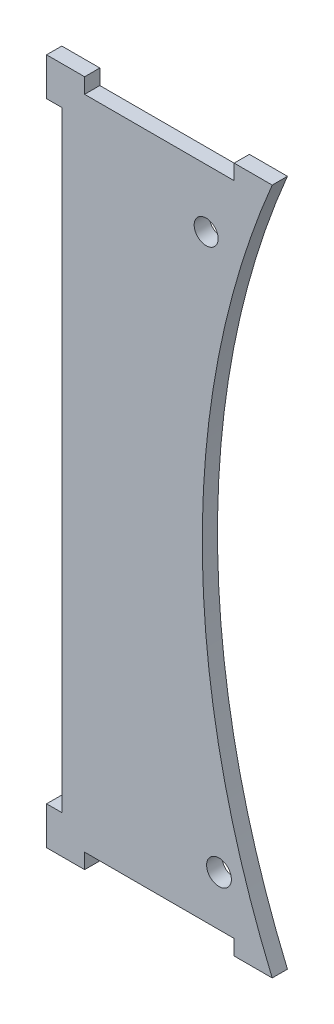
ISO-10303-21;
HEADER;
FILE_DESCRIPTION(('STEP AP214'),'2;1');
FILE_NAME('part.step','',(''),(''),'','','');
FILE_SCHEMA(('AUTOMOTIVE_DESIGN { 1 0 10303 214 1 1 1 1 }'));
ENDSEC;
DATA;
#1=APPLICATION_CONTEXT('core data for automotive mechanical design processes');
#2=APPLICATION_PROTOCOL_DEFINITION('international standard','automotive_design',2000,#1);
#3=PRODUCT_CONTEXT('',#1,'mechanical');
#4=PRODUCT('Part','Part','',(#3));
#5=PRODUCT_RELATED_PRODUCT_CATEGORY('part','',(#4));
#6=PRODUCT_DEFINITION_FORMATION('','',#4);
#7=PRODUCT_DEFINITION_CONTEXT('part definition',#1,'design');
#8=PRODUCT_DEFINITION('design','',#6,#7);
#9=PRODUCT_DEFINITION_SHAPE('','',#8);
#10=(LENGTH_UNIT() NAMED_UNIT(*) SI_UNIT(.MILLI.,.METRE.));
#11=(NAMED_UNIT(*) PLANE_ANGLE_UNIT() SI_UNIT($,.RADIAN.));
#12=(NAMED_UNIT(*) SI_UNIT($,.STERADIAN.) SOLID_ANGLE_UNIT());
#13=UNCERTAINTY_MEASURE_WITH_UNIT(LENGTH_MEASURE(1.E-05),#10,'distance_accuracy_value','');
#14=(GEOMETRIC_REPRESENTATION_CONTEXT(3) GLOBAL_UNCERTAINTY_ASSIGNED_CONTEXT((#13)) GLOBAL_UNIT_ASSIGNED_CONTEXT((#10,
#11,#12)) REPRESENTATION_CONTEXT('',''));
#15=CARTESIAN_POINT('',(0.,0.,0.));
#16=DIRECTION('',(0.,0.,1.));
#17=DIRECTION('',(1.,0.,0.));
#18=AXIS2_PLACEMENT_3D('',#15,#16,#17);
#19=CARTESIAN_POINT('',(338.870481156332,-148.49363352269,5.08));
#20=DIRECTION('',(0.,0.,-1.));
#21=DIRECTION('',(-1.,0.,0.));
#22=AXIS2_PLACEMENT_3D('',#19,#20,#21);
#23=CYLINDRICAL_SURFACE('',#22,293.026669626808);
#24=CARTESIAN_POINT('',(338.870481156332,-148.49363352269,0.));
#25=DIRECTION('',(0.,0.,1.));
#26=DIRECTION('',(1.,0.,0.));
#27=AXIS2_PLACEMENT_3D('',#24,#25,#26);
#28=CIRCLE('',#27,293.026669626808);
#29=CARTESIAN_POINT('',(69.1901437708773,-33.8762494125753,0.));
#30=VERTEX_POINT('',#29);
#31=CARTESIAN_POINT('',(69.1901437708773,-263.111017632805,0.));
#32=VERTEX_POINT('',#31);
#33=EDGE_CURVE('E184',#30,#32,#28,.T.);
#34=ORIENTED_EDGE('',*,*,#33,.F.);
#35=DIRECTION('',(0.,0.,-1.));
#36=VECTOR('',#35,1.);
#37=CARTESIAN_POINT('',(69.1901437708773,-33.8762494125753,5.08));
#38=LINE('',#37,#36);
#39=CARTESIAN_POINT('',(69.1901437708773,-33.8762494125753,5.08));
#40=VERTEX_POINT('',#39);
#41=EDGE_CURVE('E11',#40,#30,#38,.T.);
#42=ORIENTED_EDGE('',*,*,#41,.F.);
#43=CARTESIAN_POINT('',(338.870481156332,-148.49363352269,5.08));
#44=DIRECTION('',(0.,0.,1.));
#45=DIRECTION('',(1.,0.,0.));
#46=AXIS2_PLACEMENT_3D('',#43,#44,#45);
#47=CIRCLE('',#46,293.026669626808);
#48=CARTESIAN_POINT('',(69.1901437708773,-263.111017632805,5.08));
#49=VERTEX_POINT('',#48);
#50=EDGE_CURVE('E229',#40,#49,#47,.T.);
#51=ORIENTED_EDGE('',*,*,#50,.T.);
#52=DIRECTION('',(0.,0.,-1.));
#53=VECTOR('',#52,1.);
#54=CARTESIAN_POINT('',(69.1901437708773,-263.111017632805,5.08));
#55=LINE('',#54,#53);
#56=EDGE_CURVE('E51',#49,#32,#55,.T.);
#57=ORIENTED_EDGE('',*,*,#56,.T.);
#58=EDGE_LOOP('',(#34,#42,#51,#57));
#59=FACE_BOUND('',#58,.T.);
#60=ADVANCED_FACE('F35',(#59),#23,.F.);
#61=CARTESIAN_POINT('',(0.,-33.8762494125752,5.08));
#62=DIRECTION('',(0.,-1.,0.));
#63=DIRECTION('',(1.,0.,0.));
#64=AXIS2_PLACEMENT_3D('',#61,#62,#63);
#65=PLANE('',#64);
#66=DIRECTION('',(-1.,0.,0.));
#67=VECTOR('',#66,1.);
#68=CARTESIAN_POINT('',(0.,-33.8762494125752,0.));
#69=LINE('',#68,#67);
#70=CARTESIAN_POINT('',(56.4901437708773,-33.8762494125753,0.));
#71=VERTEX_POINT('',#70);
#72=EDGE_CURVE('E186',#30,#71,#69,.T.);
#73=ORIENTED_EDGE('',*,*,#72,.T.);
#74=DIRECTION('',(0.,0.,-1.));
#75=VECTOR('',#74,1.);
#76=CARTESIAN_POINT('',(56.4901437708773,-33.8762494125753,5.08));
#77=LINE('',#76,#75);
#78=CARTESIAN_POINT('',(56.4901437708773,-33.8762494125753,5.08));
#79=VERTEX_POINT('',#78);
#80=EDGE_CURVE('E43',#79,#71,#77,.T.);
#81=ORIENTED_EDGE('',*,*,#80,.F.);
#82=DIRECTION('',(-1.,0.,0.));
#83=VECTOR('',#82,1.);
#84=CARTESIAN_POINT('',(0.,-33.8762494125752,5.08));
#85=LINE('',#84,#83);
#86=EDGE_CURVE('E283',#40,#79,#85,.T.);
#87=ORIENTED_EDGE('',*,*,#86,.F.);
#88=ORIENTED_EDGE('',*,*,#41,.T.);
#89=EDGE_LOOP('',(#73,#81,#87,#88));
#90=FACE_BOUND('',#89,.T.);
#91=ADVANCED_FACE('F323',(#90),#65,.F.);
#92=CARTESIAN_POINT('',(56.4901437708773,0.,5.08));
#93=DIRECTION('',(1.,0.,0.));
#94=DIRECTION('',(0.,0.,-1.));
#95=AXIS2_PLACEMENT_3D('',#92,#93,#94);
#96=PLANE('',#95);
#97=DIRECTION('',(0.,-1.,0.));
#98=VECTOR('',#97,1.);
#99=CARTESIAN_POINT('',(56.4901437708773,0.,0.));
#100=LINE('',#99,#98);
#101=CARTESIAN_POINT('',(56.4901437708773,-38.9562494125753,0.));
#102=VERTEX_POINT('',#101);
#103=EDGE_CURVE('E188',#71,#102,#100,.T.);
#104=ORIENTED_EDGE('',*,*,#103,.T.);
#105=DIRECTION('',(0.,0.,-1.));
#106=VECTOR('',#105,1.);
#107=CARTESIAN_POINT('',(56.4901437708773,-38.9562494125753,5.08));
#108=LINE('',#107,#106);
#109=CARTESIAN_POINT('',(56.4901437708773,-38.9562494125753,5.08));
#110=VERTEX_POINT('',#109);
#111=EDGE_CURVE('E254',#110,#102,#108,.T.);
#112=ORIENTED_EDGE('',*,*,#111,.F.);
#113=DIRECTION('',(0.,-1.,0.));
#114=VECTOR('',#113,1.);
#115=CARTESIAN_POINT('',(56.4901437708773,0.,5.08));
#116=LINE('',#115,#114);
#117=EDGE_CURVE('E263',#79,#110,#116,.T.);
#118=ORIENTED_EDGE('',*,*,#117,.F.);
#119=ORIENTED_EDGE('',*,*,#80,.T.);
#120=EDGE_LOOP('',(#104,#112,#118,#119));
#121=FACE_BOUND('',#120,.T.);
#122=ADVANCED_FACE('F261',(#121),#96,.F.);
#123=CARTESIAN_POINT('',(0.,-38.9562494125753,5.08));
#124=DIRECTION('',(0.,-1.,0.));
#125=DIRECTION('',(0.,0.,-1.));
#126=AXIS2_PLACEMENT_3D('',#123,#124,#125);
#127=PLANE('',#126);
#128=DIRECTION('',(-1.,0.,0.));
#129=VECTOR('',#128,1.);
#130=CARTESIAN_POINT('',(0.,-38.9562494125753,0.));
#131=LINE('',#130,#129);
#132=CARTESIAN_POINT('',(6.56624495932001,-38.9562494125753,0.));
#133=VERTEX_POINT('',#132);
#134=EDGE_CURVE('E190',#102,#133,#131,.T.);
#135=ORIENTED_EDGE('',*,*,#134,.T.);
#136=DIRECTION('',(0.,0.,-1.));
#137=VECTOR('',#136,1.);
#138=CARTESIAN_POINT('',(6.56624495932001,-38.9562494125753,5.08));
#139=LINE('',#138,#137);
#140=CARTESIAN_POINT('',(6.56624495932001,-38.9562494125753,5.08));
#141=VERTEX_POINT('',#140);
#142=EDGE_CURVE('E252',#141,#133,#139,.T.);
#143=ORIENTED_EDGE('',*,*,#142,.F.);
#144=DIRECTION('',(-1.,0.,0.));
#145=VECTOR('',#144,1.);
#146=CARTESIAN_POINT('',(0.,-38.9562494125753,5.08));
#147=LINE('',#146,#145);
#148=EDGE_CURVE('E277',#110,#141,#147,.T.);
#149=ORIENTED_EDGE('',*,*,#148,.F.);
#150=ORIENTED_EDGE('',*,*,#111,.T.);
#151=EDGE_LOOP('',(#135,#143,#149,#150));
#152=FACE_BOUND('',#151,.T.);
#153=ADVANCED_FACE('F274',(#152),#127,.F.);
#154=CARTESIAN_POINT('',(6.56624495932001,0.,5.08));
#155=DIRECTION('',(1.,0.,0.));
#156=DIRECTION('',(0.,0.,-1.));
#157=AXIS2_PLACEMENT_3D('',#154,#155,#156);
#158=PLANE('',#157);
#159=DIRECTION('',(0.,-1.,0.));
#160=VECTOR('',#159,1.);
#161=CARTESIAN_POINT('',(6.56624495932001,0.,0.));
#162=LINE('',#161,#160);
#163=CARTESIAN_POINT('',(6.56624495932001,-33.8762494125753,0.));
#164=VERTEX_POINT('',#163);
#165=EDGE_CURVE('E193',#164,#133,#162,.T.);
#166=ORIENTED_EDGE('',*,*,#165,.F.);
#167=DIRECTION('',(0.,0.,-1.));
#168=VECTOR('',#167,1.);
#169=CARTESIAN_POINT('',(6.56624495932001,-33.8762494125753,5.08));
#170=LINE('',#169,#168);
#171=CARTESIAN_POINT('',(6.56624495932001,-33.8762494125753,5.08));
#172=VERTEX_POINT('',#171);
#173=EDGE_CURVE('E250',#172,#164,#170,.T.);
#174=ORIENTED_EDGE('',*,*,#173,.F.);
#175=DIRECTION('',(0.,-1.,0.));
#176=VECTOR('',#175,1.);
#177=CARTESIAN_POINT('',(6.56624495932001,0.,5.08));
#178=LINE('',#177,#176);
#179=EDGE_CURVE('E279',#172,#141,#178,.T.);
#180=ORIENTED_EDGE('',*,*,#179,.T.);
#181=ORIENTED_EDGE('',*,*,#142,.T.);
#182=EDGE_LOOP('',(#166,#174,#180,#181));
#183=FACE_BOUND('',#182,.T.);
#184=ADVANCED_FACE('F445',(#183),#158,.T.);
#185=CARTESIAN_POINT('',(0.,-33.8762494125753,5.08));
#186=DIRECTION('',(0.,-1.,0.));
#187=DIRECTION('',(1.,0.,0.));
#188=AXIS2_PLACEMENT_3D('',#185,#186,#187);
#189=PLANE('',#188);
#190=DIRECTION('',(-1.,0.,0.));
#191=VECTOR('',#190,1.);
#192=CARTESIAN_POINT('',(0.,-33.8762494125753,0.));
#193=LINE('',#192,#191);
#194=CARTESIAN_POINT('',(-6.13375504068001,-33.8762494125753,0.));
#195=VERTEX_POINT('',#194);
#196=EDGE_CURVE('E196',#164,#195,#193,.T.);
#197=ORIENTED_EDGE('',*,*,#196,.T.);
#198=DIRECTION('',(0.,0.,-1.));
#199=VECTOR('',#198,1.);
#200=CARTESIAN_POINT('',(-6.13375504068001,-33.8762494125753,5.08));
#201=LINE('',#200,#199);
#202=CARTESIAN_POINT('',(-6.13375504068001,-33.8762494125753,5.08));
#203=VERTEX_POINT('',#202);
#204=EDGE_CURVE('E247',#203,#195,#201,.T.);
#205=ORIENTED_EDGE('',*,*,#204,.F.);
#206=DIRECTION('',(-1.,0.,0.));
#207=VECTOR('',#206,1.);
#208=CARTESIAN_POINT('',(0.,-33.8762494125753,5.08));
#209=LINE('',#208,#207);
#210=EDGE_CURVE('E281',#172,#203,#209,.T.);
#211=ORIENTED_EDGE('',*,*,#210,.F.);
#212=ORIENTED_EDGE('',*,*,#173,.T.);
#213=EDGE_LOOP('',(#197,#205,#211,#212));
#214=FACE_BOUND('',#213,.T.);
#215=ADVANCED_FACE('F436',(#214),#189,.F.);
#216=CARTESIAN_POINT('',(-6.13375504067994,0.,5.08));
#217=DIRECTION('',(1.,0.,0.));
#218=DIRECTION('',(0.,1.,0.));
#219=AXIS2_PLACEMENT_3D('',#216,#217,#218);
#220=PLANE('',#219);
#221=DIRECTION('',(0.,-1.,0.));
#222=VECTOR('',#221,1.);
#223=CARTESIAN_POINT('',(-6.13375504067994,0.,0.));
#224=LINE('',#223,#222);
#225=CARTESIAN_POINT('',(-6.13375504068003,-46.5762494125753,0.));
#226=VERTEX_POINT('',#225);
#227=EDGE_CURVE('E198',#195,#226,#224,.T.);
#228=ORIENTED_EDGE('',*,*,#227,.T.);
#229=DIRECTION('',(0.,0.,-1.));
#230=VECTOR('',#229,1.);
#231=CARTESIAN_POINT('',(-6.13375504068003,-46.5762494125753,5.08));
#232=LINE('',#231,#230);
#233=CARTESIAN_POINT('',(-6.13375504068003,-46.5762494125753,5.08));
#234=VERTEX_POINT('',#233);
#235=EDGE_CURVE('E244',#234,#226,#232,.T.);
#236=ORIENTED_EDGE('',*,*,#235,.F.);
#237=DIRECTION('',(0.,-1.,0.));
#238=VECTOR('',#237,1.);
#239=CARTESIAN_POINT('',(-6.13375504067994,0.,5.08));
#240=LINE('',#239,#238);
#241=EDGE_CURVE('E288',#203,#234,#240,.T.);
#242=ORIENTED_EDGE('',*,*,#241,.F.);
#243=ORIENTED_EDGE('',*,*,#204,.T.);
#244=EDGE_LOOP('',(#228,#236,#242,#243));
#245=FACE_BOUND('',#244,.T.);
#246=ADVANCED_FACE('F427',(#245),#220,.F.);
#247=CARTESIAN_POINT('',(0.,-46.5762494125753,5.08));
#248=DIRECTION('',(0.,1.,0.));
#249=DIRECTION('',(0.,0.,1.));
#250=AXIS2_PLACEMENT_3D('',#247,#248,#249);
#251=PLANE('',#250);
#252=DIRECTION('',(1.,0.,0.));
#253=VECTOR('',#252,1.);
#254=CARTESIAN_POINT('',(0.,-46.5762494125753,0.));
#255=LINE('',#254,#253);
#256=CARTESIAN_POINT('',(-1.05375504068003,-46.5762494125753,0.));
#257=VERTEX_POINT('',#256);
#258=EDGE_CURVE('E200',#226,#257,#255,.T.);
#259=ORIENTED_EDGE('',*,*,#258,.T.);
#260=DIRECTION('',(0.,0.,-1.));
#261=VECTOR('',#260,1.);
#262=CARTESIAN_POINT('',(-1.05375504068003,-46.5762494125753,5.08));
#263=LINE('',#262,#261);
#264=CARTESIAN_POINT('',(-1.05375504068003,-46.5762494125753,5.08));
#265=VERTEX_POINT('',#264);
#266=EDGE_CURVE('E241',#265,#257,#263,.T.);
#267=ORIENTED_EDGE('',*,*,#266,.F.);
#268=DIRECTION('',(1.,0.,0.));
#269=VECTOR('',#268,1.);
#270=CARTESIAN_POINT('',(0.,-46.5762494125753,5.08));
#271=LINE('',#270,#269);
#272=EDGE_CURVE('E290',#234,#265,#271,.T.);
#273=ORIENTED_EDGE('',*,*,#272,.F.);
#274=ORIENTED_EDGE('',*,*,#235,.T.);
#275=EDGE_LOOP('',(#259,#267,#273,#274));
#276=FACE_BOUND('',#275,.T.);
#277=ADVANCED_FACE('F418',(#276),#251,.F.);
#278=CARTESIAN_POINT('',(-1.05375504068003,0.,5.08));
#279=DIRECTION('',(1.,0.,0.));
#280=DIRECTION('',(0.,0.,-1.));
#281=AXIS2_PLACEMENT_3D('',#278,#279,#280);
#282=PLANE('',#281);
#283=DIRECTION('',(0.,-1.,0.));
#284=VECTOR('',#283,1.);
#285=CARTESIAN_POINT('',(-1.05375504068003,0.,0.));
#286=LINE('',#285,#284);
#287=CARTESIAN_POINT('',(-1.05375504068003,-250.411017632805,0.));
#288=VERTEX_POINT('',#287);
#289=EDGE_CURVE('E202',#257,#288,#286,.T.);
#290=ORIENTED_EDGE('',*,*,#289,.T.);
#291=DIRECTION('',(0.,0.,-1.));
#292=VECTOR('',#291,1.);
#293=CARTESIAN_POINT('',(-1.05375504068003,-250.411017632805,5.08));
#294=LINE('',#293,#292);
#295=CARTESIAN_POINT('',(-1.05375504068003,-250.411017632805,5.08));
#296=VERTEX_POINT('',#295);
#297=EDGE_CURVE('E239',#296,#288,#294,.T.);
#298=ORIENTED_EDGE('',*,*,#297,.F.);
#299=DIRECTION('',(0.,-1.,0.));
#300=VECTOR('',#299,1.);
#301=CARTESIAN_POINT('',(-1.05375504068003,0.,5.08));
#302=LINE('',#301,#300);
#303=EDGE_CURVE('E292',#265,#296,#302,.T.);
#304=ORIENTED_EDGE('',*,*,#303,.F.);
#305=ORIENTED_EDGE('',*,*,#266,.T.);
#306=EDGE_LOOP('',(#290,#298,#304,#305));
#307=FACE_BOUND('',#306,.T.);
#308=ADVANCED_FACE('F409',(#307),#282,.F.);
#309=CARTESIAN_POINT('',(0.,-250.411017632805,5.08));
#310=DIRECTION('',(0.,1.,0.));
#311=DIRECTION('',(0.,0.,1.));
#312=AXIS2_PLACEMENT_3D('',#309,#310,#311);
#313=PLANE('',#312);
#314=DIRECTION('',(1.,0.,0.));
#315=VECTOR('',#314,1.);
#316=CARTESIAN_POINT('',(0.,-250.411017632805,0.));
#317=LINE('',#316,#315);
#318=CARTESIAN_POINT('',(-6.13375504068003,-250.411017632805,0.));
#319=VERTEX_POINT('',#318);
#320=EDGE_CURVE('E205',#319,#288,#317,.T.);
#321=ORIENTED_EDGE('',*,*,#320,.F.);
#322=DIRECTION('',(0.,0.,-1.));
#323=VECTOR('',#322,1.);
#324=CARTESIAN_POINT('',(-6.13375504068003,-250.411017632805,5.08));
#325=LINE('',#324,#323);
#326=CARTESIAN_POINT('',(-6.13375504068003,-250.411017632805,5.08));
#327=VERTEX_POINT('',#326);
#328=EDGE_CURVE('E237',#327,#319,#325,.T.);
#329=ORIENTED_EDGE('',*,*,#328,.F.);
#330=DIRECTION('',(1.,0.,0.));
#331=VECTOR('',#330,1.);
#332=CARTESIAN_POINT('',(0.,-250.411017632805,5.08));
#333=LINE('',#332,#331);
#334=EDGE_CURVE('E294',#327,#296,#333,.T.);
#335=ORIENTED_EDGE('',*,*,#334,.T.);
#336=ORIENTED_EDGE('',*,*,#297,.T.);
#337=EDGE_LOOP('',(#321,#329,#335,#336));
#338=FACE_BOUND('',#337,.T.);
#339=ADVANCED_FACE('F401',(#338),#313,.T.);
#340=CARTESIAN_POINT('',(-6.13375504068098,0.,5.08));
#341=DIRECTION('',(1.,0.,0.));
#342=DIRECTION('',(0.,1.,0.));
#343=AXIS2_PLACEMENT_3D('',#340,#341,#342);
#344=PLANE('',#343);
#345=DIRECTION('',(0.,-1.,0.));
#346=VECTOR('',#345,1.);
#347=CARTESIAN_POINT('',(-6.13375504068098,0.,0.));
#348=LINE('',#347,#346);
#349=CARTESIAN_POINT('',(-6.13375504067998,-263.111017632805,0.));
#350=VERTEX_POINT('',#349);
#351=EDGE_CURVE('E208',#319,#350,#348,.T.);
#352=ORIENTED_EDGE('',*,*,#351,.T.);
#353=DIRECTION('',(0.,0.,-1.));
#354=VECTOR('',#353,1.);
#355=CARTESIAN_POINT('',(-6.13375504067998,-263.111017632805,5.08));
#356=LINE('',#355,#354);
#357=CARTESIAN_POINT('',(-6.13375504067998,-263.111017632805,5.08));
#358=VERTEX_POINT('',#357);
#359=EDGE_CURVE('E235',#358,#350,#356,.T.);
#360=ORIENTED_EDGE('',*,*,#359,.F.);
#361=DIRECTION('',(0.,-1.,0.));
#362=VECTOR('',#361,1.);
#363=CARTESIAN_POINT('',(-6.13375504068098,0.,5.08));
#364=LINE('',#363,#362);
#365=EDGE_CURVE('E297',#327,#358,#364,.T.);
#366=ORIENTED_EDGE('',*,*,#365,.F.);
#367=ORIENTED_EDGE('',*,*,#328,.T.);
#368=EDGE_LOOP('',(#352,#360,#366,#367));
#369=FACE_BOUND('',#368,.T.);
#370=ADVANCED_FACE('F308',(#369),#344,.F.);
#371=CARTESIAN_POINT('',(-1.15004688900983E-12,-263.111017632805,5.08));
#372=DIRECTION('',(0.,-1.,0.));
#373=DIRECTION('',(1.,0.,0.));
#374=AXIS2_PLACEMENT_3D('',#371,#372,#373);
#375=PLANE('',#374);
#376=DIRECTION('',(-1.,0.,0.));
#377=VECTOR('',#376,1.);
#378=CARTESIAN_POINT('',(-1.15004688900983E-12,-263.111017632805,0.));
#379=LINE('',#378,#377);
#380=CARTESIAN_POINT('',(6.56624495932001,-263.111017632805,0.));
#381=VERTEX_POINT('',#380);
#382=EDGE_CURVE('E211',#381,#350,#379,.T.);
#383=ORIENTED_EDGE('',*,*,#382,.F.);
#384=DIRECTION('',(0.,0.,-1.));
#385=VECTOR('',#384,1.);
#386=CARTESIAN_POINT('',(6.56624495932001,-263.111017632805,5.08));
#387=LINE('',#386,#385);
#388=CARTESIAN_POINT('',(6.56624495932001,-263.111017632805,5.08));
#389=VERTEX_POINT('',#388);
#390=EDGE_CURVE('E233',#389,#381,#387,.T.);
#391=ORIENTED_EDGE('',*,*,#390,.F.);
#392=DIRECTION('',(-1.,0.,0.));
#393=VECTOR('',#392,1.);
#394=CARTESIAN_POINT('',(-1.15004688900983E-12,-263.111017632805,5.08));
#395=LINE('',#394,#393);
#396=EDGE_CURVE('E299',#389,#358,#395,.T.);
#397=ORIENTED_EDGE('',*,*,#396,.T.);
#398=ORIENTED_EDGE('',*,*,#359,.T.);
#399=EDGE_LOOP('',(#383,#391,#397,#398));
#400=FACE_BOUND('',#399,.T.);
#401=ADVANCED_FACE('F303',(#400),#375,.T.);
#402=CARTESIAN_POINT('',(6.56624495932001,0.,5.08));
#403=DIRECTION('',(-1.,0.,0.));
#404=DIRECTION('',(0.,0.,1.));
#405=AXIS2_PLACEMENT_3D('',#402,#403,#404);
#406=PLANE('',#405);
#407=DIRECTION('',(0.,1.,0.));
#408=VECTOR('',#407,1.);
#409=CARTESIAN_POINT('',(6.56624495932001,0.,0.));
#410=LINE('',#409,#408);
#411=CARTESIAN_POINT('',(6.56624495932001,-258.031017632805,0.));
#412=VERTEX_POINT('',#411);
#413=EDGE_CURVE('E214',#381,#412,#410,.T.);
#414=ORIENTED_EDGE('',*,*,#413,.T.);
#415=DIRECTION('',(0.,0.,-1.));
#416=VECTOR('',#415,1.);
#417=CARTESIAN_POINT('',(6.56624495932001,-258.031017632805,5.08));
#418=LINE('',#417,#416);
#419=CARTESIAN_POINT('',(6.56624495932001,-258.031017632805,5.08));
#420=VERTEX_POINT('',#419);
#421=EDGE_CURVE('E158',#420,#412,#418,.T.);
#422=ORIENTED_EDGE('',*,*,#421,.F.);
#423=DIRECTION('',(0.,1.,0.));
#424=VECTOR('',#423,1.);
#425=CARTESIAN_POINT('',(6.56624495932001,0.,5.08));
#426=LINE('',#425,#424);
#427=EDGE_CURVE('E169',#389,#420,#426,.T.);
#428=ORIENTED_EDGE('',*,*,#427,.F.);
#429=ORIENTED_EDGE('',*,*,#390,.T.);
#430=EDGE_LOOP('',(#414,#422,#428,#429));
#431=FACE_BOUND('',#430,.T.);
#432=ADVANCED_FACE('F313',(#431),#406,.F.);
#433=CARTESIAN_POINT('',(0.,-258.031017632805,5.08));
#434=DIRECTION('',(0.,-1.,0.));
#435=DIRECTION('',(0.,0.,-1.));
#436=AXIS2_PLACEMENT_3D('',#433,#434,#435);
#437=PLANE('',#436);
#438=DIRECTION('',(-1.,0.,0.));
#439=VECTOR('',#438,1.);
#440=CARTESIAN_POINT('',(0.,-258.031017632805,0.));
#441=LINE('',#440,#439);
#442=CARTESIAN_POINT('',(56.4901437708772,-258.031017632805,0.));
#443=VERTEX_POINT('',#442);
#444=EDGE_CURVE('E154',#443,#412,#441,.T.);
#445=ORIENTED_EDGE('',*,*,#444,.F.);
#446=DIRECTION('',(0.,0.,-1.));
#447=VECTOR('',#446,1.);
#448=CARTESIAN_POINT('',(56.4901437708772,-258.031017632805,5.08));
#449=LINE('',#448,#447);
#450=CARTESIAN_POINT('',(56.4901437708772,-258.031017632805,5.08));
#451=VERTEX_POINT('',#450);
#452=EDGE_CURVE('E149',#451,#443,#449,.T.);
#453=ORIENTED_EDGE('',*,*,#452,.F.);
#454=DIRECTION('',(-1.,0.,0.));
#455=VECTOR('',#454,1.);
#456=CARTESIAN_POINT('',(0.,-258.031017632805,5.08));
#457=LINE('',#456,#455);
#458=EDGE_CURVE('E152',#451,#420,#457,.T.);
#459=ORIENTED_EDGE('',*,*,#458,.T.);
#460=ORIENTED_EDGE('',*,*,#421,.T.);
#461=EDGE_LOOP('',(#445,#453,#459,#460));
#462=FACE_BOUND('',#461,.T.);
#463=ADVANCED_FACE('F151',(#462),#437,.T.);
#464=CARTESIAN_POINT('',(56.4901437708772,0.,5.08));
#465=DIRECTION('',(-1.,0.,0.));
#466=DIRECTION('',(0.,0.,1.));
#467=AXIS2_PLACEMENT_3D('',#464,#465,#466);
#468=PLANE('',#467);
#469=DIRECTION('',(0.,1.,0.));
#470=VECTOR('',#469,1.);
#471=CARTESIAN_POINT('',(56.4901437708772,0.,0.));
#472=LINE('',#471,#470);
#473=CARTESIAN_POINT('',(56.4901437708772,-263.111017632805,0.));
#474=VERTEX_POINT('',#473);
#475=EDGE_CURVE('E218',#474,#443,#472,.T.);
#476=ORIENTED_EDGE('',*,*,#475,.F.);
#477=DIRECTION('',(0.,0.,-1.));
#478=VECTOR('',#477,1.);
#479=CARTESIAN_POINT('',(56.4901437708772,-263.111017632805,5.08));
#480=LINE('',#479,#478);
#481=CARTESIAN_POINT('',(56.4901437708772,-263.111017632805,5.08));
#482=VERTEX_POINT('',#481);
#483=EDGE_CURVE('E100',#482,#474,#480,.T.);
#484=ORIENTED_EDGE('',*,*,#483,.F.);
#485=DIRECTION('',(0.,1.,0.));
#486=VECTOR('',#485,1.);
#487=CARTESIAN_POINT('',(56.4901437708772,0.,5.08));
#488=LINE('',#487,#486);
#489=EDGE_CURVE('E166',#482,#451,#488,.T.);
#490=ORIENTED_EDGE('',*,*,#489,.T.);
#491=ORIENTED_EDGE('',*,*,#452,.T.);
#492=EDGE_LOOP('',(#476,#484,#490,#491));
#493=FACE_BOUND('',#492,.T.);
#494=ADVANCED_FACE('F172',(#493),#468,.T.);
#495=CARTESIAN_POINT('',(51.4251906698455,-241.419788327559,5.08));
#496=DIRECTION('',(0.,0.,-1.));
#497=DIRECTION('',(-1.,0.,0.));
#498=AXIS2_PLACEMENT_3D('',#495,#496,#497);
#499=CYLINDRICAL_SURFACE('',#498,4.13699959152322);
#500=CARTESIAN_POINT('',(51.4251906698455,-241.419788327559,5.08));
#501=DIRECTION('',(0.,0.,1.));
#502=DIRECTION('',(1.,0.,0.));
#503=AXIS2_PLACEMENT_3D('',#500,#501,#502);
#504=CIRCLE('',#503,4.13699959152322);
#505=CARTESIAN_POINT('',(55.5621902613688,-241.419788327559,5.08));
#506=VERTEX_POINT('',#505);
#507=EDGE_CURVE('E175',#506,#506,#504,.T.);
#508=ORIENTED_EDGE('',*,*,#507,.T.);
#509=EDGE_LOOP('',(#508));
#510=FACE_BOUND('',#509,.T.);
#511=CARTESIAN_POINT('',(51.4251906698455,-241.419788327559,0.));
#512=DIRECTION('',(0.,0.,1.));
#513=DIRECTION('',(1.,0.,0.));
#514=AXIS2_PLACEMENT_3D('',#511,#512,#513);
#515=CIRCLE('',#514,4.13699959152322);
#516=CARTESIAN_POINT('',(55.5621902613688,-241.419788327559,0.));
#517=VERTEX_POINT('',#516);
#518=EDGE_CURVE('E223',#517,#517,#515,.T.);
#519=ORIENTED_EDGE('',*,*,#518,.F.);
#520=EDGE_LOOP('',(#519));
#521=FACE_BOUND('',#520,.T.);
#522=ADVANCED_FACE('F330',(#510,#521),#499,.F.);
#523=CARTESIAN_POINT('',(1.15004688900982E-12,-263.111017632805,5.08));
#524=DIRECTION('',(0.,-1.,0.));
#525=DIRECTION('',(1.,0.,0.));
#526=AXIS2_PLACEMENT_3D('',#523,#524,#525);
#527=PLANE('',#526);
#528=DIRECTION('',(-1.,0.,0.));
#529=VECTOR('',#528,1.);
#530=CARTESIAN_POINT('',(1.15004688900982E-12,-263.111017632805,0.));
#531=LINE('',#530,#529);
#532=EDGE_CURVE('E220',#32,#474,#531,.T.);
#533=ORIENTED_EDGE('',*,*,#532,.F.);
#534=ORIENTED_EDGE('',*,*,#56,.F.);
#535=DIRECTION('',(-1.,0.,0.));
#536=VECTOR('',#535,1.);
#537=CARTESIAN_POINT('',(1.15004688900982E-12,-263.111017632805,5.08));
#538=LINE('',#537,#536);
#539=EDGE_CURVE('E173',#49,#482,#538,.T.);
#540=ORIENTED_EDGE('',*,*,#539,.T.);
#541=ORIENTED_EDGE('',*,*,#483,.T.);
#542=EDGE_LOOP('',(#533,#534,#540,#541));
#543=FACE_BOUND('',#542,.T.);
#544=ADVANCED_FACE('F327',(#543),#527,.T.);
#545=CARTESIAN_POINT('',(47.1320648033626,-58.4354653305917,5.08));
#546=DIRECTION('',(0.,0.,-1.));
#547=DIRECTION('',(-1.,0.,0.));
#548=AXIS2_PLACEMENT_3D('',#545,#546,#547);
#549=CYLINDRICAL_SURFACE('',#548,4.00000000000001);
#550=CARTESIAN_POINT('',(47.1320648033626,-58.4354653305917,5.08));
#551=DIRECTION('',(0.,0.,1.));
#552=DIRECTION('',(1.,0.,0.));
#553=AXIS2_PLACEMENT_3D('',#550,#551,#552);
#554=CIRCLE('',#553,4.00000000000001);
#555=CARTESIAN_POINT('',(51.1320648033626,-58.4354653305917,5.08));
#556=VERTEX_POINT('',#555);
#557=EDGE_CURVE('E181',#556,#556,#554,.T.);
#558=ORIENTED_EDGE('',*,*,#557,.T.);
#559=EDGE_LOOP('',(#558));
#560=FACE_BOUND('',#559,.T.);
#561=CARTESIAN_POINT('',(47.1320648033626,-58.4354653305917,0.));
#562=DIRECTION('',(0.,0.,1.));
#563=DIRECTION('',(1.,0.,0.));
#564=AXIS2_PLACEMENT_3D('',#561,#562,#563);
#565=CIRCLE('',#564,4.00000000000001);
#566=CARTESIAN_POINT('',(51.1320648033626,-58.4354653305917,0.));
#567=VERTEX_POINT('',#566);
#568=EDGE_CURVE('E226',#567,#567,#565,.T.);
#569=ORIENTED_EDGE('',*,*,#568,.F.);
#570=EDGE_LOOP('',(#569));
#571=FACE_BOUND('',#570,.T.);
#572=ADVANCED_FACE('F329',(#560,#571),#549,.F.);
#573=CARTESIAN_POINT('',(0.,0.,5.08));
#574=DIRECTION('',(0.,0.,1.));
#575=DIRECTION('',(1.,0.,0.));
#576=AXIS2_PLACEMENT_3D('',#573,#574,#575);
#577=PLANE('',#576);
#578=ORIENTED_EDGE('',*,*,#50,.F.);
#579=ORIENTED_EDGE('',*,*,#86,.T.);
#580=ORIENTED_EDGE('',*,*,#117,.T.);
#581=ORIENTED_EDGE('',*,*,#148,.T.);
#582=ORIENTED_EDGE('',*,*,#179,.F.);
#583=ORIENTED_EDGE('',*,*,#210,.T.);
#584=ORIENTED_EDGE('',*,*,#241,.T.);
#585=ORIENTED_EDGE('',*,*,#272,.T.);
#586=ORIENTED_EDGE('',*,*,#303,.T.);
#587=ORIENTED_EDGE('',*,*,#334,.F.);
#588=ORIENTED_EDGE('',*,*,#365,.T.);
#589=ORIENTED_EDGE('',*,*,#396,.F.);
#590=ORIENTED_EDGE('',*,*,#427,.T.);
#591=ORIENTED_EDGE('',*,*,#458,.F.);
#592=ORIENTED_EDGE('',*,*,#489,.F.);
#593=ORIENTED_EDGE('',*,*,#539,.F.);
#594=EDGE_LOOP('',(#578,#579,#580,#581,#582,#583,#584,#585,#586,#587,#588,#589,#590,#591,#592,#593));
#595=FACE_BOUND('',#594,.T.);
#596=ORIENTED_EDGE('',*,*,#507,.F.);
#597=EDGE_LOOP('',(#596));
#598=FACE_BOUND('',#597,.T.);
#599=ORIENTED_EDGE('',*,*,#557,.F.);
#600=EDGE_LOOP('',(#599));
#601=FACE_BOUND('',#600,.T.);
#602=ADVANCED_FACE('F163',(#595,#598,#601),#577,.T.);
#603=CARTESIAN_POINT('',(0.,0.,0.));
#604=DIRECTION('',(0.,0.,1.));
#605=DIRECTION('',(1.,0.,0.));
#606=AXIS2_PLACEMENT_3D('',#603,#604,#605);
#607=PLANE('',#606);
#608=ORIENTED_EDGE('',*,*,#33,.T.);
#609=ORIENTED_EDGE('',*,*,#532,.T.);
#610=ORIENTED_EDGE('',*,*,#475,.T.);
#611=ORIENTED_EDGE('',*,*,#444,.T.);
#612=ORIENTED_EDGE('',*,*,#413,.F.);
#613=ORIENTED_EDGE('',*,*,#382,.T.);
#614=ORIENTED_EDGE('',*,*,#351,.F.);
#615=ORIENTED_EDGE('',*,*,#320,.T.);
#616=ORIENTED_EDGE('',*,*,#289,.F.);
#617=ORIENTED_EDGE('',*,*,#258,.F.);
#618=ORIENTED_EDGE('',*,*,#227,.F.);
#619=ORIENTED_EDGE('',*,*,#196,.F.);
#620=ORIENTED_EDGE('',*,*,#165,.T.);
#621=ORIENTED_EDGE('',*,*,#134,.F.);
#622=ORIENTED_EDGE('',*,*,#103,.F.);
#623=ORIENTED_EDGE('',*,*,#72,.F.);
#624=EDGE_LOOP('',(#608,#609,#610,#611,#612,#613,#614,#615,#616,#617,#618,#619,#620,#621,#622,#623));
#625=FACE_BOUND('',#624,.T.);
#626=ORIENTED_EDGE('',*,*,#518,.T.);
#627=EDGE_LOOP('',(#626));
#628=FACE_BOUND('',#627,.T.);
#629=ORIENTED_EDGE('',*,*,#568,.T.);
#630=EDGE_LOOP('',(#629));
#631=FACE_BOUND('',#630,.T.);
#632=ADVANCED_FACE('F268',(#625,#628,#631),#607,.F.);
#633=CLOSED_SHELL('',(#60,#91,#122,#153,#184,#215,#246,#277,#308,#339,#370,#401,#432,#463,#494,
#522,#544,#572,#602,#632));
#634=MANIFOLD_SOLID_BREP('B2',#633);
#635=ADVANCED_BREP_SHAPE_REPRESENTATION('',(#18,#634),#14);
#636=SHAPE_DEFINITION_REPRESENTATION(#9,#635);
ENDSEC;
END-ISO-10303-21;
